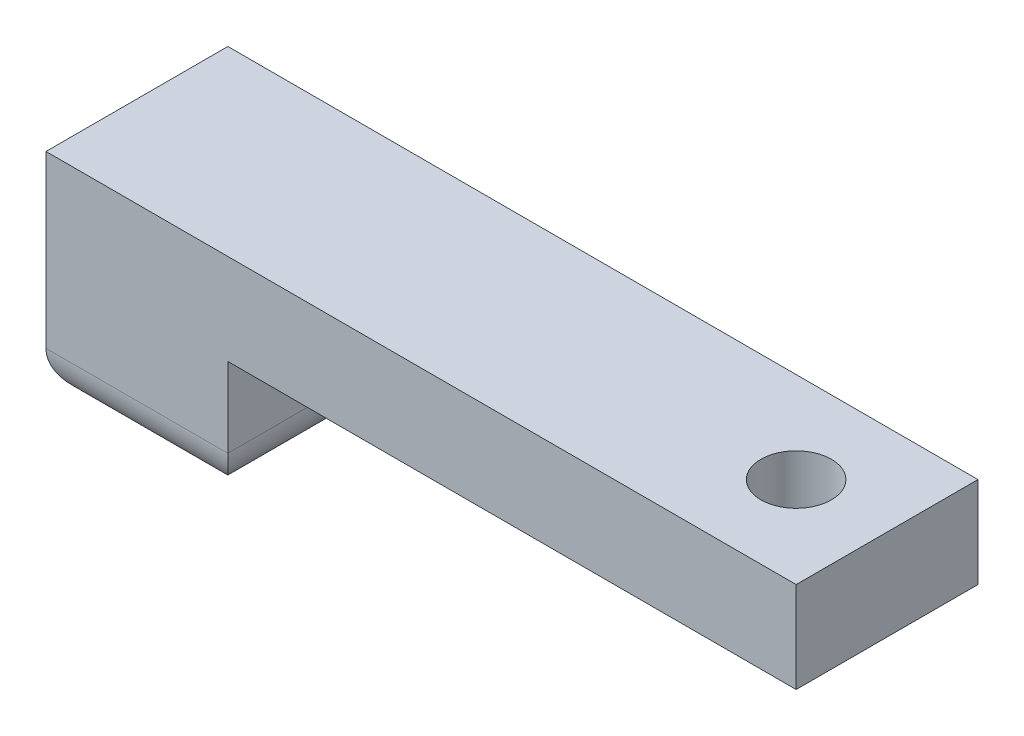
ISO-10303-21;
HEADER;
FILE_DESCRIPTION(('STEP AP214'),'2;1');
FILE_NAME('part.step','',(''),(''),'','','');
FILE_SCHEMA(('AUTOMOTIVE_DESIGN { 1 0 10303 214 1 1 1 1 }'));
ENDSEC;
DATA;
#1=APPLICATION_CONTEXT('core data for automotive mechanical design processes');
#2=APPLICATION_PROTOCOL_DEFINITION('international standard','automotive_design',2000,#1);
#3=PRODUCT_CONTEXT('',#1,'mechanical');
#4=PRODUCT('Part','Part','',(#3));
#5=PRODUCT_RELATED_PRODUCT_CATEGORY('part','',(#4));
#6=PRODUCT_DEFINITION_FORMATION('','',#4);
#7=PRODUCT_DEFINITION_CONTEXT('part definition',#1,'design');
#8=PRODUCT_DEFINITION('design','',#6,#7);
#9=PRODUCT_DEFINITION_SHAPE('','',#8);
#10=(LENGTH_UNIT() NAMED_UNIT(*) SI_UNIT(.MILLI.,.METRE.));
#11=(NAMED_UNIT(*) PLANE_ANGLE_UNIT() SI_UNIT($,.RADIAN.));
#12=(NAMED_UNIT(*) SI_UNIT($,.STERADIAN.) SOLID_ANGLE_UNIT());
#13=UNCERTAINTY_MEASURE_WITH_UNIT(LENGTH_MEASURE(1.E-05),#10,'distance_accuracy_value','');
#14=(GEOMETRIC_REPRESENTATION_CONTEXT(3) GLOBAL_UNCERTAINTY_ASSIGNED_CONTEXT((#13)) GLOBAL_UNIT_ASSIGNED_CONTEXT((#10,
#11,#12)) REPRESENTATION_CONTEXT('',''));
#15=CARTESIAN_POINT('',(0.,0.,0.));
#16=DIRECTION('',(0.,0.,1.));
#17=DIRECTION('',(1.,0.,0.));
#18=AXIS2_PLACEMENT_3D('',#15,#16,#17);
#19=CARTESIAN_POINT('',(0.,0.,0.));
#20=DIRECTION('',(0.,1.,0.));
#21=DIRECTION('',(0.,0.,1.));
#22=AXIS2_PLACEMENT_3D('',#19,#20,#21);
#23=PLANE('',#22);
#24=CARTESIAN_POINT('',(12.71875,0.,-2.328125));
#25=DIRECTION('',(0.,1.,0.));
#26=DIRECTION('',(0.,0.,1.));
#27=AXIS2_PLACEMENT_3D('',#24,#25,#26);
#28=CIRCLE('',#27,1.55);
#29=CARTESIAN_POINT('',(12.71875,0.,-0.778124999999997));
#30=VERTEX_POINT('',#29);
#31=EDGE_CURVE('E157',#30,#30,#28,.T.);
#32=ORIENTED_EDGE('',*,*,#31,.T.);
#33=EDGE_LOOP('',(#32));
#34=FACE_BOUND('',#33,.T.);
#35=DIRECTION('',(0.,0.,1.));
#36=VECTOR('',#35,1.);
#37=CARTESIAN_POINT('',(-8.28125,0.,1.671875));
#38=LINE('',#37,#36);
#39=CARTESIAN_POINT('',(-8.28125,0.,-6.328125));
#40=VERTEX_POINT('',#39);
#41=CARTESIAN_POINT('',(-8.28125,0.,1.671875));
#42=VERTEX_POINT('',#41);
#43=EDGE_CURVE('E136',#40,#42,#38,.T.);
#44=ORIENTED_EDGE('',*,*,#43,.F.);
#45=DIRECTION('',(-1.,0.,0.));
#46=VECTOR('',#45,1.);
#47=CARTESIAN_POINT('',(-16.28125,0.,-6.328125));
#48=LINE('',#47,#46);
#49=CARTESIAN_POINT('',(16.71875,0.,-6.328125));
#50=VERTEX_POINT('',#49);
#51=EDGE_CURVE('E169',#50,#40,#48,.T.);
#52=ORIENTED_EDGE('',*,*,#51,.F.);
#53=DIRECTION('',(0.,0.,-1.));
#54=VECTOR('',#53,1.);
#55=CARTESIAN_POINT('',(16.71875,0.,-6.328125));
#56=LINE('',#55,#54);
#57=CARTESIAN_POINT('',(16.71875,0.,1.671875));
#58=VERTEX_POINT('',#57);
#59=EDGE_CURVE('E143',#58,#50,#56,.T.);
#60=ORIENTED_EDGE('',*,*,#59,.F.);
#61=DIRECTION('',(1.,0.,0.));
#62=VECTOR('',#61,1.);
#63=CARTESIAN_POINT('',(-16.28125,0.,1.671875));
#64=LINE('',#63,#62);
#65=EDGE_CURVE('E129',#42,#58,#64,.T.);
#66=ORIENTED_EDGE('',*,*,#65,.F.);
#67=EDGE_LOOP('',(#44,#52,#60,#66));
#68=FACE_BOUND('',#67,.T.);
#69=ADVANCED_FACE('F41',(#34,#68),#23,.F.);
#70=CARTESIAN_POINT('',(0.,4.,0.));
#71=DIRECTION('',(0.,1.,0.));
#72=DIRECTION('',(0.,0.,1.));
#73=AXIS2_PLACEMENT_3D('',#70,#71,#72);
#74=PLANE('',#73);
#75=DIRECTION('',(0.,0.,1.));
#76=VECTOR('',#75,1.);
#77=CARTESIAN_POINT('',(-16.28125,4.,-6.328125));
#78=LINE('',#77,#76);
#79=CARTESIAN_POINT('',(-16.28125,4.,-6.328125));
#80=VERTEX_POINT('',#79);
#81=CARTESIAN_POINT('',(-16.28125,4.,1.671875));
#82=VERTEX_POINT('',#81);
#83=EDGE_CURVE('E164',#80,#82,#78,.T.);
#84=ORIENTED_EDGE('',*,*,#83,.T.);
#85=DIRECTION('',(1.,0.,0.));
#86=VECTOR('',#85,1.);
#87=CARTESIAN_POINT('',(-16.28125,4.,1.671875));
#88=LINE('',#87,#86);
#89=CARTESIAN_POINT('',(16.71875,4.,1.671875));
#90=VERTEX_POINT('',#89);
#91=EDGE_CURVE('E168',#82,#90,#88,.T.);
#92=ORIENTED_EDGE('',*,*,#91,.T.);
#93=DIRECTION('',(0.,0.,-1.));
#94=VECTOR('',#93,1.);
#95=CARTESIAN_POINT('',(16.71875,4.,-6.328125));
#96=LINE('',#95,#94);
#97=CARTESIAN_POINT('',(16.71875,4.,-6.328125));
#98=VERTEX_POINT('',#97);
#99=EDGE_CURVE('E172',#90,#98,#96,.T.);
#100=ORIENTED_EDGE('',*,*,#99,.T.);
#101=DIRECTION('',(-1.,0.,0.));
#102=VECTOR('',#101,1.);
#103=CARTESIAN_POINT('',(-16.28125,4.,-6.328125));
#104=LINE('',#103,#102);
#105=EDGE_CURVE('E175',#98,#80,#104,.T.);
#106=ORIENTED_EDGE('',*,*,#105,.T.);
#107=EDGE_LOOP('',(#84,#92,#100,#106));
#108=FACE_BOUND('',#107,.T.);
#109=CARTESIAN_POINT('',(12.71875,4.,-2.328125));
#110=DIRECTION('',(0.,1.,0.));
#111=DIRECTION('',(0.,0.,1.));
#112=AXIS2_PLACEMENT_3D('',#109,#110,#111);
#113=CIRCLE('',#112,1.55);
#114=CARTESIAN_POINT('',(12.71875,4.,-0.778124999999997));
#115=VERTEX_POINT('',#114);
#116=EDGE_CURVE('E145',#115,#115,#113,.T.);
#117=ORIENTED_EDGE('',*,*,#116,.F.);
#118=EDGE_LOOP('',(#117));
#119=FACE_BOUND('',#118,.T.);
#120=ADVANCED_FACE('F245',(#108,#119),#74,.T.);
#121=CARTESIAN_POINT('',(-16.28125,4.,-6.328125));
#122=DIRECTION('',(1.,0.,0.));
#123=DIRECTION('',(0.,0.,-1.));
#124=AXIS2_PLACEMENT_3D('',#121,#122,#123);
#125=PLANE('',#124);
#126=DIRECTION('',(0.,-1.,0.));
#127=VECTOR('',#126,1.);
#128=CARTESIAN_POINT('',(-16.28125,4.,-6.328125));
#129=LINE('',#128,#127);
#130=CARTESIAN_POINT('',(-16.28125,-3.5,-6.328125));
#131=VERTEX_POINT('',#130);
#132=EDGE_CURVE('E177',#80,#131,#129,.T.);
#133=ORIENTED_EDGE('',*,*,#132,.T.);
#134=DIRECTION('',(0.,0.,-1.));
#135=VECTOR('',#134,1.);
#136=CARTESIAN_POINT('',(-16.28125,-3.5,1.671875));
#137=LINE('',#136,#135);
#138=CARTESIAN_POINT('',(-16.28125,-3.5,1.671875));
#139=VERTEX_POINT('',#138);
#140=EDGE_CURVE('E11',#131,#139,#137,.F.);
#141=ORIENTED_EDGE('',*,*,#140,.T.);
#142=DIRECTION('',(0.,-1.,0.));
#143=VECTOR('',#142,1.);
#144=CARTESIAN_POINT('',(-16.28125,4.,1.671875));
#145=LINE('',#144,#143);
#146=EDGE_CURVE('E191',#82,#139,#145,.T.);
#147=ORIENTED_EDGE('',*,*,#146,.F.);
#148=ORIENTED_EDGE('',*,*,#83,.F.);
#149=EDGE_LOOP('',(#133,#141,#147,#148));
#150=FACE_BOUND('',#149,.T.);
#151=ADVANCED_FACE('F251',(#150),#125,.F.);
#152=CARTESIAN_POINT('',(-16.28125,4.,1.671875));
#153=DIRECTION('',(0.,0.,-1.));
#154=DIRECTION('',(-1.,0.,0.));
#155=AXIS2_PLACEMENT_3D('',#152,#153,#154);
#156=PLANE('',#155);
#157=ORIENTED_EDGE('',*,*,#146,.T.);
#158=DIRECTION('',(-1.,0.,0.));
#159=VECTOR('',#158,1.);
#160=CARTESIAN_POINT('',(-8.28125,-3.5,1.671875));
#161=LINE('',#160,#159);
#162=CARTESIAN_POINT('',(-8.28125,-3.5,1.671875));
#163=VERTEX_POINT('',#162);
#164=EDGE_CURVE('E132',#139,#163,#161,.F.);
#165=ORIENTED_EDGE('',*,*,#164,.T.);
#166=DIRECTION('',(0.,1.,0.));
#167=VECTOR('',#166,1.);
#168=CARTESIAN_POINT('',(-8.28125,-5.5,1.671875));
#169=LINE('',#168,#167);
#170=EDGE_CURVE('E124',#163,#42,#169,.T.);
#171=ORIENTED_EDGE('',*,*,#170,.T.);
#172=ORIENTED_EDGE('',*,*,#65,.T.);
#173=DIRECTION('',(0.,-1.,0.));
#174=VECTOR('',#173,1.);
#175=CARTESIAN_POINT('',(16.71875,4.,1.671875));
#176=LINE('',#175,#174);
#177=EDGE_CURVE('E188',#90,#58,#176,.T.);
#178=ORIENTED_EDGE('',*,*,#177,.F.);
#179=ORIENTED_EDGE('',*,*,#91,.F.);
#180=EDGE_LOOP('',(#157,#165,#171,#172,#178,#179));
#181=FACE_BOUND('',#180,.T.);
#182=ADVANCED_FACE('F127',(#181),#156,.F.);
#183=CARTESIAN_POINT('',(16.71875,4.,-6.328125));
#184=DIRECTION('',(-1.,0.,0.));
#185=DIRECTION('',(0.,0.,1.));
#186=AXIS2_PLACEMENT_3D('',#183,#184,#185);
#187=PLANE('',#186);
#188=ORIENTED_EDGE('',*,*,#59,.T.);
#189=DIRECTION('',(0.,-1.,0.));
#190=VECTOR('',#189,1.);
#191=CARTESIAN_POINT('',(16.71875,4.,-6.328125));
#192=LINE('',#191,#190);
#193=EDGE_CURVE('E184',#98,#50,#192,.T.);
#194=ORIENTED_EDGE('',*,*,#193,.F.);
#195=ORIENTED_EDGE('',*,*,#99,.F.);
#196=ORIENTED_EDGE('',*,*,#177,.T.);
#197=EDGE_LOOP('',(#188,#194,#195,#196));
#198=FACE_BOUND('',#197,.T.);
#199=ADVANCED_FACE('F260',(#198),#187,.F.);
#200=CARTESIAN_POINT('',(-16.28125,4.,-6.328125));
#201=DIRECTION('',(0.,0.,1.));
#202=DIRECTION('',(1.,0.,0.));
#203=AXIS2_PLACEMENT_3D('',#200,#201,#202);
#204=PLANE('',#203);
#205=DIRECTION('',(0.,1.,0.));
#206=VECTOR('',#205,1.);
#207=CARTESIAN_POINT('',(-8.28125,-5.5,-6.328125));
#208=LINE('',#207,#206);
#209=CARTESIAN_POINT('',(-8.28125,-3.5,-6.328125));
#210=VERTEX_POINT('',#209);
#211=EDGE_CURVE('E135',#210,#40,#208,.T.);
#212=ORIENTED_EDGE('',*,*,#211,.F.);
#213=DIRECTION('',(1.,0.,0.));
#214=VECTOR('',#213,1.);
#215=CARTESIAN_POINT('',(-16.28125,-3.5,-6.328125));
#216=LINE('',#215,#214);
#217=EDGE_CURVE('E51',#210,#131,#216,.F.);
#218=ORIENTED_EDGE('',*,*,#217,.T.);
#219=ORIENTED_EDGE('',*,*,#132,.F.);
#220=ORIENTED_EDGE('',*,*,#105,.F.);
#221=ORIENTED_EDGE('',*,*,#193,.T.);
#222=ORIENTED_EDGE('',*,*,#51,.T.);
#223=EDGE_LOOP('',(#212,#218,#219,#220,#221,#222));
#224=FACE_BOUND('',#223,.T.);
#225=ADVANCED_FACE('F256',(#224),#204,.F.);
#226=CARTESIAN_POINT('',(12.71875,4.,-2.328125));
#227=DIRECTION('',(0.,-1.,0.));
#228=DIRECTION('',(0.,0.,-1.));
#229=AXIS2_PLACEMENT_3D('',#226,#227,#228);
#230=CYLINDRICAL_SURFACE('',#229,1.55);
#231=ORIENTED_EDGE('',*,*,#116,.T.);
#232=EDGE_LOOP('',(#231));
#233=FACE_BOUND('',#232,.T.);
#234=ORIENTED_EDGE('',*,*,#31,.F.);
#235=EDGE_LOOP('',(#234));
#236=FACE_BOUND('',#235,.T.);
#237=ADVANCED_FACE('F259',(#233,#236),#230,.F.);
#238=CARTESIAN_POINT('',(-8.28125,-5.5,1.671875));
#239=DIRECTION('',(-1.,0.,0.));
#240=DIRECTION('',(0.,0.,1.));
#241=AXIS2_PLACEMENT_3D('',#238,#239,#240);
#242=PLANE('',#241);
#243=ORIENTED_EDGE('',*,*,#170,.F.);
#244=DIRECTION('',(0.,0.,1.));
#245=VECTOR('',#244,1.);
#246=CARTESIAN_POINT('',(-8.28125,-3.5,-6.328125));
#247=LINE('',#246,#245);
#248=EDGE_CURVE('E72',#163,#210,#247,.F.);
#249=ORIENTED_EDGE('',*,*,#248,.T.);
#250=ORIENTED_EDGE('',*,*,#211,.T.);
#251=ORIENTED_EDGE('',*,*,#43,.T.);
#252=EDGE_LOOP('',(#243,#249,#250,#251));
#253=FACE_BOUND('',#252,.T.);
#254=ADVANCED_FACE('F147',(#253),#242,.F.);
#255=CARTESIAN_POINT('',(0.,-5.5,0.));
#256=DIRECTION('',(0.,-1.,0.));
#257=DIRECTION('',(0.,0.,-1.));
#258=AXIS2_PLACEMENT_3D('',#255,#256,#257);
#259=PLANE('',#258);
#260=DIRECTION('',(0.,0.,1.));
#261=VECTOR('',#260,1.);
#262=CARTESIAN_POINT('',(-10.28125,-5.5,1.671875));
#263=LINE('',#262,#261);
#264=CARTESIAN_POINT('',(-10.28125,-5.5,-4.328125));
#265=VERTEX_POINT('',#264);
#266=CARTESIAN_POINT('',(-10.28125,-5.5,-0.328124999999997));
#267=VERTEX_POINT('',#266);
#268=EDGE_CURVE('E200',#265,#267,#263,.T.);
#269=ORIENTED_EDGE('',*,*,#268,.T.);
#270=DIRECTION('',(-1.,0.,0.));
#271=VECTOR('',#270,1.);
#272=CARTESIAN_POINT('',(-16.28125,-5.5,-0.328124999999997));
#273=LINE('',#272,#271);
#274=CARTESIAN_POINT('',(-14.28125,-5.5,-0.328124999999997));
#275=VERTEX_POINT('',#274);
#276=EDGE_CURVE('E203',#267,#275,#273,.T.);
#277=ORIENTED_EDGE('',*,*,#276,.T.);
#278=DIRECTION('',(0.,0.,-1.));
#279=VECTOR('',#278,1.);
#280=CARTESIAN_POINT('',(-14.28125,-5.5,-6.328125));
#281=LINE('',#280,#279);
#282=CARTESIAN_POINT('',(-14.28125,-5.5,-4.328125));
#283=VERTEX_POINT('',#282);
#284=EDGE_CURVE('E194',#275,#283,#281,.T.);
#285=ORIENTED_EDGE('',*,*,#284,.T.);
#286=DIRECTION('',(1.,0.,0.));
#287=VECTOR('',#286,1.);
#288=CARTESIAN_POINT('',(-8.28125,-5.5,-4.328125));
#289=LINE('',#288,#287);
#290=EDGE_CURVE('E197',#283,#265,#289,.T.);
#291=ORIENTED_EDGE('',*,*,#290,.T.);
#292=EDGE_LOOP('',(#269,#277,#285,#291));
#293=FACE_BOUND('',#292,.T.);
#294=ADVANCED_FACE('F231',(#293),#259,.T.);
#295=CARTESIAN_POINT('',(0.,-3.5,-4.328125));
#296=DIRECTION('',(-1.,0.,0.));
#297=DIRECTION('',(0.,0.,1.));
#298=AXIS2_PLACEMENT_3D('',#295,#296,#297);
#299=CYLINDRICAL_SURFACE('',#298,2.);
#300=CARTESIAN_POINT('',(-14.28125,-3.5,-4.328125));
#301=DIRECTION('',(-0.707106781186547,0.,0.707106781186547));
#302=DIRECTION('',(0.707106781186547,0.,0.707106781186547));
#303=AXIS2_PLACEMENT_3D('',#300,#301,#302);
#304=ELLIPSE('',#303,2.82842712474619,2.);
#305=EDGE_CURVE('E154',#131,#283,#304,.T.);
#306=ORIENTED_EDGE('',*,*,#305,.F.);
#307=ORIENTED_EDGE('',*,*,#217,.F.);
#308=CARTESIAN_POINT('',(-10.28125,-3.5,-4.328125));
#309=DIRECTION('',(-0.707106781186547,0.,-0.707106781186547));
#310=DIRECTION('',(-0.707106781186547,0.,0.707106781186547));
#311=AXIS2_PLACEMENT_3D('',#308,#309,#310);
#312=ELLIPSE('',#311,2.82842712474619,2.);
#313=EDGE_CURVE('E45',#265,#210,#312,.F.);
#314=ORIENTED_EDGE('',*,*,#313,.F.);
#315=ORIENTED_EDGE('',*,*,#290,.F.);
#316=EDGE_LOOP('',(#306,#307,#314,#315));
#317=FACE_BOUND('',#316,.T.);
#318=ADVANCED_FACE('F43',(#317),#299,.T.);
#319=CARTESIAN_POINT('',(-10.28125,-3.5,0.));
#320=DIRECTION('',(0.,0.,-1.));
#321=DIRECTION('',(-1.,0.,0.));
#322=AXIS2_PLACEMENT_3D('',#319,#320,#321);
#323=CYLINDRICAL_SURFACE('',#322,2.);
#324=ORIENTED_EDGE('',*,*,#313,.T.);
#325=ORIENTED_EDGE('',*,*,#248,.F.);
#326=CARTESIAN_POINT('',(-10.28125,-3.5,-0.328124999999997));
#327=DIRECTION('',(0.707106781186547,0.,-0.707106781186547));
#328=DIRECTION('',(-0.707106781186547,0.,-0.707106781186547));
#329=AXIS2_PLACEMENT_3D('',#326,#327,#328);
#330=ELLIPSE('',#329,2.82842712474619,2.);
#331=EDGE_CURVE('E216',#267,#163,#330,.F.);
#332=ORIENTED_EDGE('',*,*,#331,.F.);
#333=ORIENTED_EDGE('',*,*,#268,.F.);
#334=EDGE_LOOP('',(#324,#325,#332,#333));
#335=FACE_BOUND('',#334,.T.);
#336=ADVANCED_FACE('F237',(#335),#323,.T.);
#337=CARTESIAN_POINT('',(-14.28125,-3.5,0.));
#338=DIRECTION('',(0.,0.,1.));
#339=DIRECTION('',(1.,0.,0.));
#340=AXIS2_PLACEMENT_3D('',#337,#338,#339);
#341=CYLINDRICAL_SURFACE('',#340,2.);
#342=ORIENTED_EDGE('',*,*,#305,.T.);
#343=ORIENTED_EDGE('',*,*,#284,.F.);
#344=CARTESIAN_POINT('',(-14.28125,-3.5,-0.328124999999997));
#345=DIRECTION('',(0.707106781186547,0.,0.707106781186547));
#346=DIRECTION('',(-0.707106781186547,0.,0.707106781186547));
#347=AXIS2_PLACEMENT_3D('',#344,#345,#346);
#348=ELLIPSE('',#347,2.82842712474619,2.);
#349=EDGE_CURVE('E213',#139,#275,#348,.T.);
#350=ORIENTED_EDGE('',*,*,#349,.F.);
#351=ORIENTED_EDGE('',*,*,#140,.F.);
#352=EDGE_LOOP('',(#342,#343,#350,#351));
#353=FACE_BOUND('',#352,.T.);
#354=ADVANCED_FACE('F224',(#353),#341,.T.);
#355=CARTESIAN_POINT('',(0.,-3.5,-0.328124999999997));
#356=DIRECTION('',(1.,0.,0.));
#357=DIRECTION('',(0.,0.,-1.));
#358=AXIS2_PLACEMENT_3D('',#355,#356,#357);
#359=CYLINDRICAL_SURFACE('',#358,2.);
#360=ORIENTED_EDGE('',*,*,#331,.T.);
#361=ORIENTED_EDGE('',*,*,#164,.F.);
#362=ORIENTED_EDGE('',*,*,#349,.T.);
#363=ORIENTED_EDGE('',*,*,#276,.F.);
#364=EDGE_LOOP('',(#360,#361,#362,#363));
#365=FACE_BOUND('',#364,.T.);
#366=ADVANCED_FACE('F235',(#365),#359,.T.);
#367=CLOSED_SHELL('',(#69,#120,#151,#182,#199,#225,#237,#254,#294,#318,#336,#354,#366));
#368=MANIFOLD_SOLID_BREP('B2',#367);
#369=ADVANCED_BREP_SHAPE_REPRESENTATION('',(#18,#368),#14);
#370=SHAPE_DEFINITION_REPRESENTATION(#9,#369);
ENDSEC;
END-ISO-10303-21;
